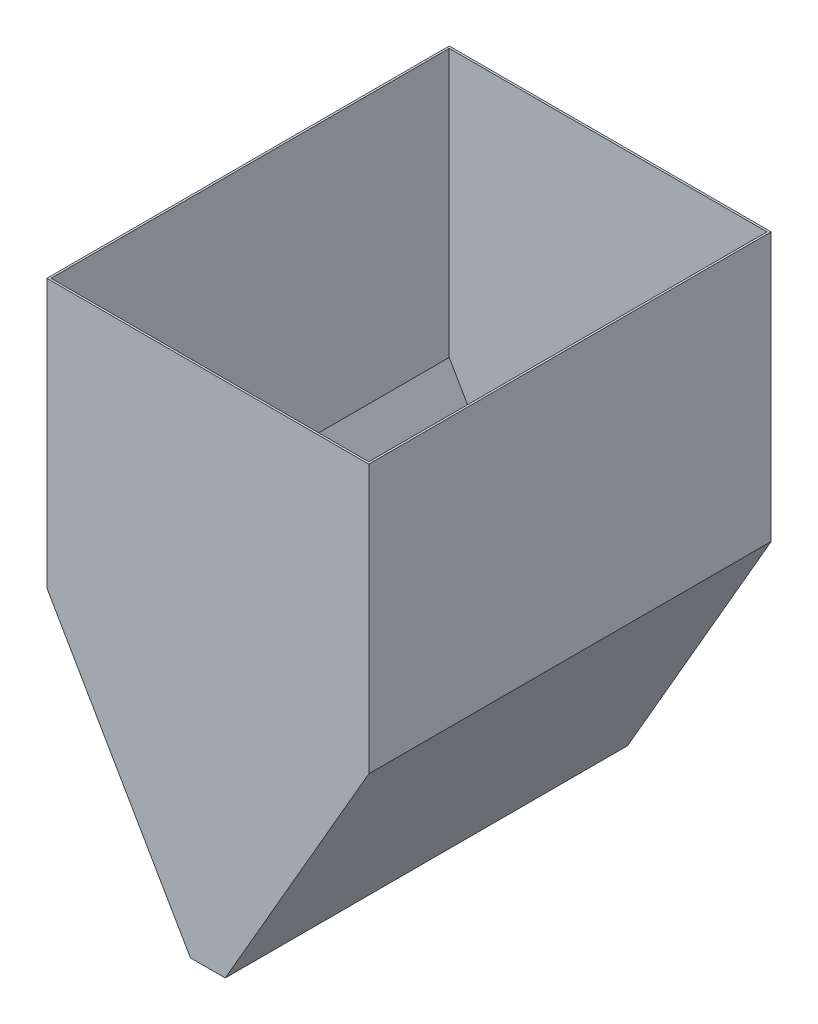
ISO-10303-21;
HEADER;
FILE_DESCRIPTION(('STEP AP214'),'2;1');
FILE_NAME('part.step','',(''),(''),'','','');
FILE_SCHEMA(('AUTOMOTIVE_DESIGN { 1 0 10303 214 1 1 1 1 }'));
ENDSEC;
DATA;
#1=APPLICATION_CONTEXT('core data for automotive mechanical design processes');
#2=APPLICATION_PROTOCOL_DEFINITION('international standard','automotive_design',2000,#1);
#3=PRODUCT_CONTEXT('',#1,'mechanical');
#4=PRODUCT('Part','Part','',(#3));
#5=PRODUCT_RELATED_PRODUCT_CATEGORY('part','',(#4));
#6=PRODUCT_DEFINITION_FORMATION('','',#4);
#7=PRODUCT_DEFINITION_CONTEXT('part definition',#1,'design');
#8=PRODUCT_DEFINITION('design','',#6,#7);
#9=PRODUCT_DEFINITION_SHAPE('','',#8);
#10=(LENGTH_UNIT() NAMED_UNIT(*) SI_UNIT(.MILLI.,.METRE.));
#11=(NAMED_UNIT(*) PLANE_ANGLE_UNIT() SI_UNIT($,.RADIAN.));
#12=(NAMED_UNIT(*) SI_UNIT($,.STERADIAN.) SOLID_ANGLE_UNIT());
#13=UNCERTAINTY_MEASURE_WITH_UNIT(LENGTH_MEASURE(1.E-05),#10,'distance_accuracy_value','');
#14=(GEOMETRIC_REPRESENTATION_CONTEXT(3) GLOBAL_UNCERTAINTY_ASSIGNED_CONTEXT((#13)) GLOBAL_UNIT_ASSIGNED_CONTEXT((#10,
#11,#12)) REPRESENTATION_CONTEXT('',''));
#15=CARTESIAN_POINT('',(0.,0.,0.));
#16=DIRECTION('',(0.,0.,1.));
#17=DIRECTION('',(1.,0.,0.));
#18=AXIS2_PLACEMENT_3D('',#15,#16,#17);
#19=CARTESIAN_POINT('',(0.,-92.664,0.));
#20=DIRECTION('',(0.,1.,0.));
#21=DIRECTION('',(0.,0.,1.));
#22=AXIS2_PLACEMENT_3D('',#19,#20,#21);
#23=PLANE('',#22);
#24=DIRECTION('',(1.,0.,0.));
#25=VECTOR('',#24,1.);
#26=CARTESIAN_POINT('',(0.,-92.664,74.24));
#27=LINE('',#26,#25);
#28=CARTESIAN_POINT('',(-5.62242589039075,-92.664,74.24));
#29=VERTEX_POINT('',#28);
#30=CARTESIAN_POINT('',(5.62242589039075,-92.664,74.24));
#31=VERTEX_POINT('',#30);
#32=EDGE_CURVE('E180',#29,#31,#27,.T.);
#33=ORIENTED_EDGE('',*,*,#32,.T.);
#34=DIRECTION('',(0.,0.,-1.));
#35=VECTOR('',#34,1.);
#36=CARTESIAN_POINT('',(5.62242589039075,-92.664,0.));
#37=LINE('',#36,#35);
#38=CARTESIAN_POINT('',(5.62242589039074,-92.664,-74.24));
#39=VERTEX_POINT('',#38);
#40=EDGE_CURVE('E171',#31,#39,#37,.T.);
#41=ORIENTED_EDGE('',*,*,#40,.T.);
#42=DIRECTION('',(-1.,0.,0.));
#43=VECTOR('',#42,1.);
#44=CARTESIAN_POINT('',(0.,-92.664,-74.24));
#45=LINE('',#44,#43);
#46=CARTESIAN_POINT('',(-5.62242589039077,-92.664,-74.24));
#47=VERTEX_POINT('',#46);
#48=EDGE_CURVE('E140',#39,#47,#45,.T.);
#49=ORIENTED_EDGE('',*,*,#48,.T.);
#50=DIRECTION('',(0.,0.,1.));
#51=VECTOR('',#50,1.);
#52=CARTESIAN_POINT('',(-5.62242589039077,-92.664,0.));
#53=LINE('',#52,#51);
#54=EDGE_CURVE('E63',#47,#29,#53,.T.);
#55=ORIENTED_EDGE('',*,*,#54,.T.);
#56=EDGE_LOOP('',(#33,#41,#49,#55));
#57=FACE_BOUND('',#56,.T.);
#58=DIRECTION('',(0.,0.,-1.));
#59=VECTOR('',#58,1.);
#60=CARTESIAN_POINT('',(6.49999999999998,-92.664,-75.));
#61=LINE('',#60,#59);
#62=CARTESIAN_POINT('',(6.49999999999999,-92.664,75.));
#63=VERTEX_POINT('',#62);
#64=CARTESIAN_POINT('',(6.49999999999998,-92.664,-75.));
#65=VERTEX_POINT('',#64);
#66=EDGE_CURVE('E341',#63,#65,#61,.T.);
#67=ORIENTED_EDGE('',*,*,#66,.F.);
#68=DIRECTION('',(1.,0.,0.));
#69=VECTOR('',#68,1.);
#70=CARTESIAN_POINT('',(-6.49999999999999,-92.664,75.));
#71=LINE('',#70,#69);
#72=CARTESIAN_POINT('',(-6.49999999999999,-92.664,75.));
#73=VERTEX_POINT('',#72);
#74=EDGE_CURVE('E252',#73,#63,#71,.T.);
#75=ORIENTED_EDGE('',*,*,#74,.F.);
#76=DIRECTION('',(0.,0.,1.));
#77=VECTOR('',#76,1.);
#78=CARTESIAN_POINT('',(-6.50000000000001,-92.664,-75.));
#79=LINE('',#78,#77);
#80=CARTESIAN_POINT('',(-6.50000000000001,-92.664,-75.));
#81=VERTEX_POINT('',#80);
#82=EDGE_CURVE('E55',#81,#73,#79,.T.);
#83=ORIENTED_EDGE('',*,*,#82,.F.);
#84=DIRECTION('',(-1.,0.,0.));
#85=VECTOR('',#84,1.);
#86=CARTESIAN_POINT('',(-6.50000000000001,-92.664,-75.));
#87=LINE('',#86,#85);
#88=EDGE_CURVE('E12',#65,#81,#87,.T.);
#89=ORIENTED_EDGE('',*,*,#88,.F.);
#90=EDGE_LOOP('',(#67,#75,#83,#89));
#91=FACE_BOUND('',#90,.T.);
#92=ADVANCED_FACE('F45',(#57,#91),#23,.F.);
#93=CARTESIAN_POINT('',(0.,0.,-75.));
#94=DIRECTION('',(0.,0.,1.));
#95=DIRECTION('',(1.,0.,0.));
#96=AXIS2_PLACEMENT_3D('',#93,#94,#95);
#97=PLANE('',#96);
#98=DIRECTION('',(-0.500002906480055,-0.866023725720894,0.));
#99=VECTOR('',#98,1.);
#100=CARTESIAN_POINT('',(60.,0.,-75.));
#101=LINE('',#100,#99);
#102=CARTESIAN_POINT('',(60.,0.,-75.));
#103=VERTEX_POINT('',#102);
#104=EDGE_CURVE('E199',#103,#65,#101,.T.);
#105=ORIENTED_EDGE('',*,*,#104,.T.);
#106=ORIENTED_EDGE('',*,*,#88,.T.);
#107=DIRECTION('',(0.500002906480055,-0.866023725720894,0.));
#108=VECTOR('',#107,1.);
#109=CARTESIAN_POINT('',(-60.,0.,-75.));
#110=LINE('',#109,#108);
#111=CARTESIAN_POINT('',(-60.,0.,-75.));
#112=VERTEX_POINT('',#111);
#113=EDGE_CURVE('E202',#112,#81,#110,.T.);
#114=ORIENTED_EDGE('',*,*,#113,.F.);
#115=DIRECTION('',(0.,-1.,0.));
#116=VECTOR('',#115,1.);
#117=CARTESIAN_POINT('',(-60.,100.,-75.));
#118=LINE('',#117,#116);
#119=CARTESIAN_POINT('',(-60.,100.,-75.));
#120=VERTEX_POINT('',#119);
#121=EDGE_CURVE('E198',#120,#112,#118,.T.);
#122=ORIENTED_EDGE('',*,*,#121,.F.);
#123=DIRECTION('',(-1.,0.,0.));
#124=VECTOR('',#123,1.);
#125=CARTESIAN_POINT('',(-60.,100.,-75.));
#126=LINE('',#125,#124);
#127=CARTESIAN_POINT('',(60.,100.,-75.));
#128=VERTEX_POINT('',#127);
#129=EDGE_CURVE('E196',#128,#120,#126,.T.);
#130=ORIENTED_EDGE('',*,*,#129,.F.);
#131=DIRECTION('',(0.,-1.,0.));
#132=VECTOR('',#131,1.);
#133=CARTESIAN_POINT('',(60.,100.,-75.));
#134=LINE('',#133,#132);
#135=EDGE_CURVE('E287',#128,#103,#134,.T.);
#136=ORIENTED_EDGE('',*,*,#135,.T.);
#137=EDGE_LOOP('',(#105,#106,#114,#122,#130,#136));
#138=FACE_BOUND('',#137,.T.);
#139=ADVANCED_FACE('F315',(#138),#97,.F.);
#140=CARTESIAN_POINT('',(-44.9998256106899,-25.980862796468,0.));
#141=DIRECTION('',(-0.866023725720894,-0.500002906480055,0.));
#142=DIRECTION('',(0.500002906480055,-0.866023725720894,0.));
#143=AXIS2_PLACEMENT_3D('',#140,#141,#142);
#144=PLANE('',#143);
#145=ORIENTED_EDGE('',*,*,#113,.T.);
#146=ORIENTED_EDGE('',*,*,#82,.T.);
#147=DIRECTION('',(0.500002906480055,-0.866023725720894,0.));
#148=VECTOR('',#147,1.);
#149=CARTESIAN_POINT('',(-60.,0.,75.));
#150=LINE('',#149,#148);
#151=CARTESIAN_POINT('',(-60.,0.,75.));
#152=VERTEX_POINT('',#151);
#153=EDGE_CURVE('E340',#152,#73,#150,.T.);
#154=ORIENTED_EDGE('',*,*,#153,.F.);
#155=DIRECTION('',(0.,0.,1.));
#156=VECTOR('',#155,1.);
#157=CARTESIAN_POINT('',(-60.,0.,-75.));
#158=LINE('',#157,#156);
#159=EDGE_CURVE('E203',#112,#152,#158,.T.);
#160=ORIENTED_EDGE('',*,*,#159,.F.);
#161=EDGE_LOOP('',(#145,#146,#154,#160));
#162=FACE_BOUND('',#161,.T.);
#163=ADVANCED_FACE('F231',(#162),#144,.T.);
#164=CARTESIAN_POINT('',(44.9998256106898,-25.9808627964679,0.));
#165=DIRECTION('',(0.866023725720894,-0.500002906480055,0.));
#166=DIRECTION('',(0.500002906480055,0.866023725720894,0.));
#167=AXIS2_PLACEMENT_3D('',#164,#165,#166);
#168=PLANE('',#167);
#169=DIRECTION('',(-0.500002906480055,-0.866023725720894,0.));
#170=VECTOR('',#169,1.);
#171=CARTESIAN_POINT('',(60.,0.,75.));
#172=LINE('',#171,#170);
#173=CARTESIAN_POINT('',(60.,0.,75.));
#174=VERTEX_POINT('',#173);
#175=EDGE_CURVE('E207',#174,#63,#172,.T.);
#176=ORIENTED_EDGE('',*,*,#175,.T.);
#177=ORIENTED_EDGE('',*,*,#66,.T.);
#178=ORIENTED_EDGE('',*,*,#104,.F.);
#179=DIRECTION('',(0.,0.,-1.));
#180=VECTOR('',#179,1.);
#181=CARTESIAN_POINT('',(60.,0.,-75.));
#182=LINE('',#181,#180);
#183=EDGE_CURVE('E49',#174,#103,#182,.T.);
#184=ORIENTED_EDGE('',*,*,#183,.F.);
#185=EDGE_LOOP('',(#176,#177,#178,#184));
#186=FACE_BOUND('',#185,.T.);
#187=ADVANCED_FACE('F221',(#186),#168,.T.);
#188=CARTESIAN_POINT('',(0.,0.,75.));
#189=DIRECTION('',(0.,0.,-1.));
#190=DIRECTION('',(-1.,0.,0.));
#191=AXIS2_PLACEMENT_3D('',#188,#189,#190);
#192=PLANE('',#191);
#193=ORIENTED_EDGE('',*,*,#153,.T.);
#194=ORIENTED_EDGE('',*,*,#74,.T.);
#195=ORIENTED_EDGE('',*,*,#175,.F.);
#196=DIRECTION('',(0.,-1.,0.));
#197=VECTOR('',#196,1.);
#198=CARTESIAN_POINT('',(60.,100.,75.));
#199=LINE('',#198,#197);
#200=CARTESIAN_POINT('',(60.,100.,75.));
#201=VERTEX_POINT('',#200);
#202=EDGE_CURVE('E292',#201,#174,#199,.T.);
#203=ORIENTED_EDGE('',*,*,#202,.F.);
#204=DIRECTION('',(1.,0.,0.));
#205=VECTOR('',#204,1.);
#206=CARTESIAN_POINT('',(-60.,100.,75.));
#207=LINE('',#206,#205);
#208=CARTESIAN_POINT('',(-60.,100.,75.));
#209=VERTEX_POINT('',#208);
#210=EDGE_CURVE('E192',#209,#201,#207,.T.);
#211=ORIENTED_EDGE('',*,*,#210,.F.);
#212=DIRECTION('',(0.,-1.,0.));
#213=VECTOR('',#212,1.);
#214=CARTESIAN_POINT('',(-60.,100.,75.));
#215=LINE('',#214,#213);
#216=EDGE_CURVE('E364',#209,#152,#215,.T.);
#217=ORIENTED_EDGE('',*,*,#216,.T.);
#218=EDGE_LOOP('',(#193,#194,#195,#203,#211,#217));
#219=FACE_BOUND('',#218,.T.);
#220=ADVANCED_FACE('F230',(#219),#192,.F.);
#221=CARTESIAN_POINT('',(-60.,100.,-75.));
#222=DIRECTION('',(1.,0.,0.));
#223=DIRECTION('',(0.,0.,-1.));
#224=AXIS2_PLACEMENT_3D('',#221,#222,#223);
#225=PLANE('',#224);
#226=ORIENTED_EDGE('',*,*,#159,.T.);
#227=ORIENTED_EDGE('',*,*,#216,.F.);
#228=DIRECTION('',(0.,0.,1.));
#229=VECTOR('',#228,1.);
#230=CARTESIAN_POINT('',(-60.,100.,-75.));
#231=LINE('',#230,#229);
#232=EDGE_CURVE('E178',#120,#209,#231,.T.);
#233=ORIENTED_EDGE('',*,*,#232,.F.);
#234=ORIENTED_EDGE('',*,*,#121,.T.);
#235=EDGE_LOOP('',(#226,#227,#233,#234));
#236=FACE_BOUND('',#235,.T.);
#237=ADVANCED_FACE('F310',(#236),#225,.F.);
#238=CARTESIAN_POINT('',(60.,100.,-75.));
#239=DIRECTION('',(-1.,0.,0.));
#240=DIRECTION('',(0.,0.,1.));
#241=AXIS2_PLACEMENT_3D('',#238,#239,#240);
#242=PLANE('',#241);
#243=ORIENTED_EDGE('',*,*,#183,.T.);
#244=ORIENTED_EDGE('',*,*,#135,.F.);
#245=DIRECTION('',(0.,0.,-1.));
#246=VECTOR('',#245,1.);
#247=CARTESIAN_POINT('',(60.,100.,-75.));
#248=LINE('',#247,#246);
#249=EDGE_CURVE('E194',#201,#128,#248,.T.);
#250=ORIENTED_EDGE('',*,*,#249,.F.);
#251=ORIENTED_EDGE('',*,*,#202,.T.);
#252=EDGE_LOOP('',(#243,#244,#250,#251));
#253=FACE_BOUND('',#252,.T.);
#254=ADVANCED_FACE('F300',(#253),#242,.F.);
#255=CARTESIAN_POINT('',(0.,100.,0.));
#256=DIRECTION('',(0.,1.,0.));
#257=DIRECTION('',(0.,0.,1.));
#258=AXIS2_PLACEMENT_3D('',#255,#256,#257);
#259=PLANE('',#258);
#260=DIRECTION('',(0.,0.,1.));
#261=VECTOR('',#260,1.);
#262=CARTESIAN_POINT('',(-59.24,100.,-75.));
#263=LINE('',#262,#261);
#264=CARTESIAN_POINT('',(-59.24,100.,-74.24));
#265=VERTEX_POINT('',#264);
#266=CARTESIAN_POINT('',(-59.24,100.,74.24));
#267=VERTEX_POINT('',#266);
#268=EDGE_CURVE('E185',#265,#267,#263,.T.);
#269=ORIENTED_EDGE('',*,*,#268,.F.);
#270=DIRECTION('',(-1.,0.,0.));
#271=VECTOR('',#270,1.);
#272=CARTESIAN_POINT('',(0.,100.,-74.24));
#273=LINE('',#272,#271);
#274=CARTESIAN_POINT('',(59.24,100.,-74.24));
#275=VERTEX_POINT('',#274);
#276=EDGE_CURVE('E165',#275,#265,#273,.T.);
#277=ORIENTED_EDGE('',*,*,#276,.F.);
#278=DIRECTION('',(0.,0.,-1.));
#279=VECTOR('',#278,1.);
#280=CARTESIAN_POINT('',(59.24,100.,-75.));
#281=LINE('',#280,#279);
#282=CARTESIAN_POINT('',(59.24,100.,74.24));
#283=VERTEX_POINT('',#282);
#284=EDGE_CURVE('E158',#283,#275,#281,.T.);
#285=ORIENTED_EDGE('',*,*,#284,.F.);
#286=DIRECTION('',(1.,0.,0.));
#287=VECTOR('',#286,1.);
#288=CARTESIAN_POINT('',(0.,100.,74.24));
#289=LINE('',#288,#287);
#290=EDGE_CURVE('E187',#267,#283,#289,.T.);
#291=ORIENTED_EDGE('',*,*,#290,.F.);
#292=EDGE_LOOP('',(#269,#277,#285,#291));
#293=FACE_BOUND('',#292,.T.);
#294=ORIENTED_EDGE('',*,*,#232,.T.);
#295=ORIENTED_EDGE('',*,*,#210,.T.);
#296=ORIENTED_EDGE('',*,*,#249,.T.);
#297=ORIENTED_EDGE('',*,*,#129,.T.);
#298=EDGE_LOOP('',(#294,#295,#296,#297));
#299=FACE_BOUND('',#298,.T.);
#300=ADVANCED_FACE('F309',(#293,#299),#259,.T.);
#301=CARTESIAN_POINT('',(0.,0.,-74.24));
#302=DIRECTION('',(0.,0.,1.));
#303=DIRECTION('',(1.,0.,0.));
#304=AXIS2_PLACEMENT_3D('',#301,#302,#303);
#305=PLANE('',#304);
#306=DIRECTION('',(-0.500002906480055,-0.866023725720894,0.));
#307=VECTOR('',#306,1.);
#308=CARTESIAN_POINT('',(44.341647579142,-25.6008605875431,-74.24));
#309=LINE('',#308,#307);
#310=CARTESIAN_POINT('',(59.24,0.203642753137021,-74.24));
#311=VERTEX_POINT('',#310);
#312=EDGE_CURVE('E136',#311,#39,#309,.T.);
#313=ORIENTED_EDGE('',*,*,#312,.F.);
#314=DIRECTION('',(0.,-1.,0.));
#315=VECTOR('',#314,1.);
#316=CARTESIAN_POINT('',(59.24,0.,-74.24));
#317=LINE('',#316,#315);
#318=EDGE_CURVE('E71',#275,#311,#317,.T.);
#319=ORIENTED_EDGE('',*,*,#318,.F.);
#320=ORIENTED_EDGE('',*,*,#276,.T.);
#321=DIRECTION('',(0.,-1.,0.));
#322=VECTOR('',#321,1.);
#323=CARTESIAN_POINT('',(-59.24,100.,-74.24));
#324=LINE('',#323,#322);
#325=CARTESIAN_POINT('',(-59.24,0.203642753137032,-74.24));
#326=VERTEX_POINT('',#325);
#327=EDGE_CURVE('E161',#265,#326,#324,.T.);
#328=ORIENTED_EDGE('',*,*,#327,.T.);
#329=DIRECTION('',(0.500002906480055,-0.866023725720894,0.));
#330=VECTOR('',#329,1.);
#331=CARTESIAN_POINT('',(-44.341647579142,-25.6008605875431,-74.24));
#332=LINE('',#331,#330);
#333=EDGE_CURVE('E144',#326,#47,#332,.T.);
#334=ORIENTED_EDGE('',*,*,#333,.T.);
#335=ORIENTED_EDGE('',*,*,#48,.F.);
#336=EDGE_LOOP('',(#313,#319,#320,#328,#334,#335));
#337=FACE_BOUND('',#336,.T.);
#338=ADVANCED_FACE('F138',(#337),#305,.T.);
#339=CARTESIAN_POINT('',(-44.341647579142,-25.6008605875431,0.));
#340=DIRECTION('',(-0.866023725720894,-0.500002906480055,0.));
#341=DIRECTION('',(0.500002906480055,-0.866023725720894,0.));
#342=AXIS2_PLACEMENT_3D('',#339,#340,#341);
#343=PLANE('',#342);
#344=ORIENTED_EDGE('',*,*,#333,.F.);
#345=DIRECTION('',(0.,0.,1.));
#346=VECTOR('',#345,1.);
#347=CARTESIAN_POINT('',(-59.24,0.203642753137032,0.));
#348=LINE('',#347,#346);
#349=CARTESIAN_POINT('',(-59.24,0.203642753137029,74.24));
#350=VERTEX_POINT('',#349);
#351=EDGE_CURVE('E145',#326,#350,#348,.T.);
#352=ORIENTED_EDGE('',*,*,#351,.T.);
#353=DIRECTION('',(0.500002906480055,-0.866023725720894,0.));
#354=VECTOR('',#353,1.);
#355=CARTESIAN_POINT('',(-44.341647579142,-25.6008605875431,74.24));
#356=LINE('',#355,#354);
#357=EDGE_CURVE('E169',#350,#29,#356,.T.);
#358=ORIENTED_EDGE('',*,*,#357,.T.);
#359=ORIENTED_EDGE('',*,*,#54,.F.);
#360=EDGE_LOOP('',(#344,#352,#358,#359));
#361=FACE_BOUND('',#360,.T.);
#362=ADVANCED_FACE('F391',(#361),#343,.F.);
#363=CARTESIAN_POINT('',(44.341647579142,-25.6008605875431,0.));
#364=DIRECTION('',(0.866023725720894,-0.500002906480055,0.));
#365=DIRECTION('',(0.500002906480055,0.866023725720894,0.));
#366=AXIS2_PLACEMENT_3D('',#363,#364,#365);
#367=PLANE('',#366);
#368=DIRECTION('',(-0.500002906480055,-0.866023725720894,0.));
#369=VECTOR('',#368,1.);
#370=CARTESIAN_POINT('',(44.341647579142,-25.6008605875431,74.24));
#371=LINE('',#370,#369);
#372=CARTESIAN_POINT('',(59.24,0.203642753137021,74.24));
#373=VERTEX_POINT('',#372);
#374=EDGE_CURVE('E150',#373,#31,#371,.T.);
#375=ORIENTED_EDGE('',*,*,#374,.F.);
#376=DIRECTION('',(0.,0.,-1.));
#377=VECTOR('',#376,1.);
#378=CARTESIAN_POINT('',(59.24,0.203642753137022,0.));
#379=LINE('',#378,#377);
#380=EDGE_CURVE('E148',#373,#311,#379,.T.);
#381=ORIENTED_EDGE('',*,*,#380,.T.);
#382=ORIENTED_EDGE('',*,*,#312,.T.);
#383=ORIENTED_EDGE('',*,*,#40,.F.);
#384=EDGE_LOOP('',(#375,#381,#382,#383));
#385=FACE_BOUND('',#384,.T.);
#386=ADVANCED_FACE('F149',(#385),#367,.F.);
#387=CARTESIAN_POINT('',(0.,0.,74.24));
#388=DIRECTION('',(0.,0.,-1.));
#389=DIRECTION('',(-1.,0.,0.));
#390=AXIS2_PLACEMENT_3D('',#387,#388,#389);
#391=PLANE('',#390);
#392=ORIENTED_EDGE('',*,*,#357,.F.);
#393=DIRECTION('',(0.,-1.,0.));
#394=VECTOR('',#393,1.);
#395=CARTESIAN_POINT('',(-59.24,0.,74.24));
#396=LINE('',#395,#394);
#397=EDGE_CURVE('E154',#267,#350,#396,.T.);
#398=ORIENTED_EDGE('',*,*,#397,.F.);
#399=ORIENTED_EDGE('',*,*,#290,.T.);
#400=DIRECTION('',(0.,-1.,0.));
#401=VECTOR('',#400,1.);
#402=CARTESIAN_POINT('',(59.24,100.,74.24));
#403=LINE('',#402,#401);
#404=EDGE_CURVE('E160',#283,#373,#403,.T.);
#405=ORIENTED_EDGE('',*,*,#404,.T.);
#406=ORIENTED_EDGE('',*,*,#374,.T.);
#407=ORIENTED_EDGE('',*,*,#32,.F.);
#408=EDGE_LOOP('',(#392,#398,#399,#405,#406,#407));
#409=FACE_BOUND('',#408,.T.);
#410=ADVANCED_FACE('F382',(#409),#391,.T.);
#411=CARTESIAN_POINT('',(-59.24,100.,-75.));
#412=DIRECTION('',(1.,0.,0.));
#413=DIRECTION('',(0.,0.,-1.));
#414=AXIS2_PLACEMENT_3D('',#411,#412,#413);
#415=PLANE('',#414);
#416=ORIENTED_EDGE('',*,*,#351,.F.);
#417=ORIENTED_EDGE('',*,*,#327,.F.);
#418=ORIENTED_EDGE('',*,*,#268,.T.);
#419=ORIENTED_EDGE('',*,*,#397,.T.);
#420=EDGE_LOOP('',(#416,#417,#418,#419));
#421=FACE_BOUND('',#420,.T.);
#422=ADVANCED_FACE('F390',(#421),#415,.T.);
#423=CARTESIAN_POINT('',(59.24,100.,-75.));
#424=DIRECTION('',(-1.,0.,0.));
#425=DIRECTION('',(0.,0.,1.));
#426=AXIS2_PLACEMENT_3D('',#423,#424,#425);
#427=PLANE('',#426);
#428=ORIENTED_EDGE('',*,*,#380,.F.);
#429=ORIENTED_EDGE('',*,*,#404,.F.);
#430=ORIENTED_EDGE('',*,*,#284,.T.);
#431=ORIENTED_EDGE('',*,*,#318,.T.);
#432=EDGE_LOOP('',(#428,#429,#430,#431));
#433=FACE_BOUND('',#432,.T.);
#434=ADVANCED_FACE('F156',(#433),#427,.T.);
#435=CLOSED_SHELL('',(#92,#139,#163,#187,#220,#237,#254,#300,#338,#362,#386,#410,#422,#434));
#436=MANIFOLD_SOLID_BREP('B2',#435);
#437=ADVANCED_BREP_SHAPE_REPRESENTATION('',(#18,#436),#14);
#438=SHAPE_DEFINITION_REPRESENTATION(#9,#437);
ENDSEC;
END-ISO-10303-21;
